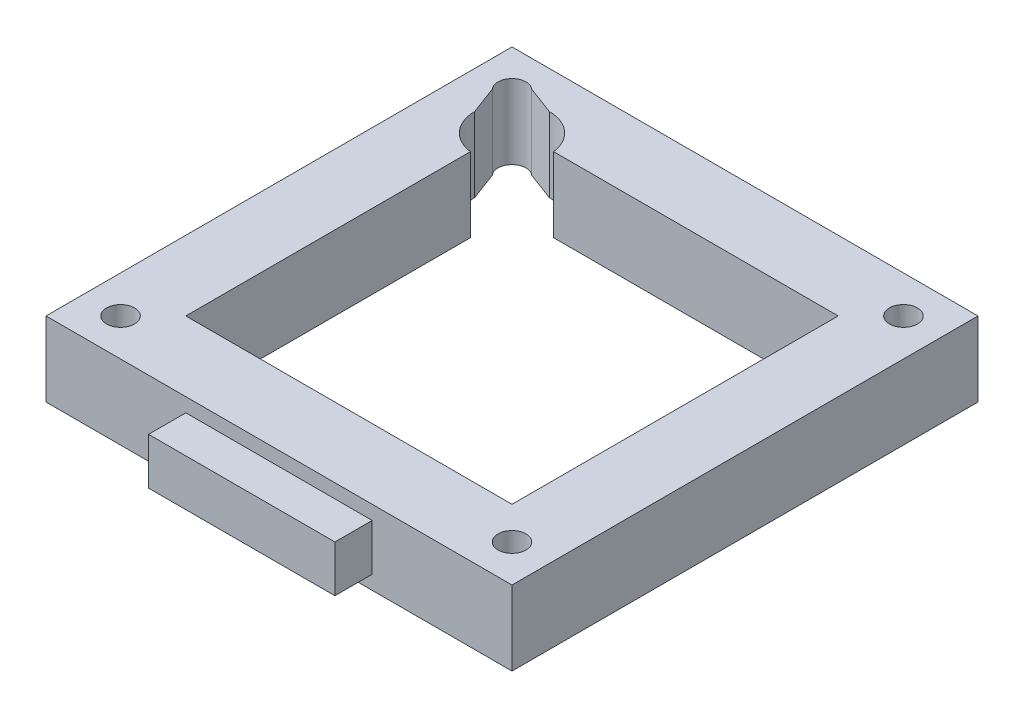
ISO-10303-21;
HEADER;
FILE_DESCRIPTION(('STEP AP214'),'2;1');
FILE_NAME('part.step','',(''),(''),'','','');
FILE_SCHEMA(('AUTOMOTIVE_DESIGN { 1 0 10303 214 1 1 1 1 }'));
ENDSEC;
DATA;
#1=APPLICATION_CONTEXT('core data for automotive mechanical design processes');
#2=APPLICATION_PROTOCOL_DEFINITION('international standard','automotive_design',2000,#1);
#3=PRODUCT_CONTEXT('',#1,'mechanical');
#4=PRODUCT('Part','Part','',(#3));
#5=PRODUCT_RELATED_PRODUCT_CATEGORY('part','',(#4));
#6=PRODUCT_DEFINITION_FORMATION('','',#4);
#7=PRODUCT_DEFINITION_CONTEXT('part definition',#1,'design');
#8=PRODUCT_DEFINITION('design','',#6,#7);
#9=PRODUCT_DEFINITION_SHAPE('','',#8);
#10=(LENGTH_UNIT() NAMED_UNIT(*) SI_UNIT(.MILLI.,.METRE.));
#11=(NAMED_UNIT(*) PLANE_ANGLE_UNIT() SI_UNIT($,.RADIAN.));
#12=(NAMED_UNIT(*) SI_UNIT($,.STERADIAN.) SOLID_ANGLE_UNIT());
#13=UNCERTAINTY_MEASURE_WITH_UNIT(LENGTH_MEASURE(1.E-05),#10,'distance_accuracy_value','');
#14=(GEOMETRIC_REPRESENTATION_CONTEXT(3) GLOBAL_UNCERTAINTY_ASSIGNED_CONTEXT((#13)) GLOBAL_UNIT_ASSIGNED_CONTEXT((#10,
#11,#12)) REPRESENTATION_CONTEXT('',''));
#15=CARTESIAN_POINT('',(0.,0.,0.));
#16=DIRECTION('',(0.,0.,1.));
#17=DIRECTION('',(1.,0.,0.));
#18=AXIS2_PLACEMENT_3D('',#15,#16,#17);
#19=CARTESIAN_POINT('',(0.,8.,25.));
#20=DIRECTION('',(0.,0.,-1.));
#21=DIRECTION('',(-1.,0.,0.));
#22=AXIS2_PLACEMENT_3D('',#19,#20,#21);
#23=PLANE('',#22);
#24=DIRECTION('',(1.,0.,0.));
#25=VECTOR('',#24,1.);
#26=CARTESIAN_POINT('',(0.,0.,25.));
#27=LINE('',#26,#25);
#28=CARTESIAN_POINT('',(-25.,0.,25.));
#29=VERTEX_POINT('',#28);
#30=CARTESIAN_POINT('',(25.,0.,25.));
#31=VERTEX_POINT('',#30);
#32=EDGE_CURVE('E384',#29,#31,#27,.T.);
#33=ORIENTED_EDGE('',*,*,#32,.T.);
#34=DIRECTION('',(0.,-1.,0.));
#35=VECTOR('',#34,1.);
#36=CARTESIAN_POINT('',(25.,8.,25.));
#37=LINE('',#36,#35);
#38=CARTESIAN_POINT('',(25.,8.,25.));
#39=VERTEX_POINT('',#38);
#40=EDGE_CURVE('E11',#39,#31,#37,.T.);
#41=ORIENTED_EDGE('',*,*,#40,.F.);
#42=DIRECTION('',(1.,0.,0.));
#43=VECTOR('',#42,1.);
#44=CARTESIAN_POINT('',(0.,8.,25.));
#45=LINE('',#44,#43);
#46=CARTESIAN_POINT('',(-25.,8.,25.));
#47=VERTEX_POINT('',#46);
#48=EDGE_CURVE('E324',#47,#39,#45,.T.);
#49=ORIENTED_EDGE('',*,*,#48,.F.);
#50=DIRECTION('',(0.,-1.,0.));
#51=VECTOR('',#50,1.);
#52=CARTESIAN_POINT('',(-25.,8.,25.));
#53=LINE('',#52,#51);
#54=EDGE_CURVE('E407',#47,#29,#53,.T.);
#55=ORIENTED_EDGE('',*,*,#54,.T.);
#56=EDGE_LOOP('',(#33,#41,#49,#55));
#57=FACE_BOUND('',#56,.T.);
#58=DIRECTION('',(1.,0.,0.));
#59=VECTOR('',#58,1.);
#60=CARTESIAN_POINT('',(0.,1.5000000000053,25.));
#61=LINE('',#60,#59);
#62=CARTESIAN_POINT('',(-10.0000000000553,1.5000000000053,25.));
#63=VERTEX_POINT('',#62);
#64=CARTESIAN_POINT('',(9.9999999999447,1.5000000000053,25.));
#65=VERTEX_POINT('',#64);
#66=EDGE_CURVE('E75',#63,#65,#61,.T.);
#67=ORIENTED_EDGE('',*,*,#66,.F.);
#68=DIRECTION('',(0.,-1.,0.));
#69=VECTOR('',#68,1.);
#70=CARTESIAN_POINT('',(-10.0000000000553,8.,25.));
#71=LINE('',#70,#69);
#72=CARTESIAN_POINT('',(-10.0000000000553,6.5000000000053,25.));
#73=VERTEX_POINT('',#72);
#74=EDGE_CURVE('E250',#73,#63,#71,.T.);
#75=ORIENTED_EDGE('',*,*,#74,.F.);
#76=DIRECTION('',(-1.,0.,0.));
#77=VECTOR('',#76,1.);
#78=CARTESIAN_POINT('',(0.,6.5000000000053,25.));
#79=LINE('',#78,#77);
#80=CARTESIAN_POINT('',(9.9999999999447,6.5000000000053,25.));
#81=VERTEX_POINT('',#80);
#82=EDGE_CURVE('E266',#81,#73,#79,.T.);
#83=ORIENTED_EDGE('',*,*,#82,.F.);
#84=DIRECTION('',(0.,1.,0.));
#85=VECTOR('',#84,1.);
#86=CARTESIAN_POINT('',(9.9999999999447,8.,25.));
#87=LINE('',#86,#85);
#88=EDGE_CURVE('E262',#65,#81,#87,.T.);
#89=ORIENTED_EDGE('',*,*,#88,.F.);
#90=EDGE_LOOP('',(#67,#75,#83,#89));
#91=FACE_BOUND('',#90,.T.);
#92=ADVANCED_FACE('F49',(#57,#91),#23,.F.);
#93=CARTESIAN_POINT('',(25.,8.,0.));
#94=DIRECTION('',(-1.,0.,0.));
#95=DIRECTION('',(0.,0.,1.));
#96=AXIS2_PLACEMENT_3D('',#93,#94,#95);
#97=PLANE('',#96);
#98=DIRECTION('',(0.,0.,-1.));
#99=VECTOR('',#98,1.);
#100=CARTESIAN_POINT('',(25.,0.,0.));
#101=LINE('',#100,#99);
#102=CARTESIAN_POINT('',(25.,0.,-25.));
#103=VERTEX_POINT('',#102);
#104=EDGE_CURVE('E388',#31,#103,#101,.T.);
#105=ORIENTED_EDGE('',*,*,#104,.T.);
#106=DIRECTION('',(0.,-1.,0.));
#107=VECTOR('',#106,1.);
#108=CARTESIAN_POINT('',(25.,8.,-25.));
#109=LINE('',#108,#107);
#110=CARTESIAN_POINT('',(25.,8.,-25.));
#111=VERTEX_POINT('',#110);
#112=EDGE_CURVE('E59',#111,#103,#109,.T.);
#113=ORIENTED_EDGE('',*,*,#112,.F.);
#114=DIRECTION('',(0.,0.,-1.));
#115=VECTOR('',#114,1.);
#116=CARTESIAN_POINT('',(25.,8.,0.));
#117=LINE('',#116,#115);
#118=EDGE_CURVE('E328',#39,#111,#117,.T.);
#119=ORIENTED_EDGE('',*,*,#118,.F.);
#120=ORIENTED_EDGE('',*,*,#40,.T.);
#121=EDGE_LOOP('',(#105,#113,#119,#120));
#122=FACE_BOUND('',#121,.T.);
#123=ADVANCED_FACE('F495',(#122),#97,.F.);
#124=CARTESIAN_POINT('',(0.,8.,-25.));
#125=DIRECTION('',(0.,0.,-1.));
#126=DIRECTION('',(-1.,0.,0.));
#127=AXIS2_PLACEMENT_3D('',#124,#125,#126);
#128=PLANE('',#127);
#129=DIRECTION('',(1.,0.,0.));
#130=VECTOR('',#129,1.);
#131=CARTESIAN_POINT('',(0.,0.,-25.));
#132=LINE('',#131,#130);
#133=CARTESIAN_POINT('',(-25.,0.,-25.));
#134=VERTEX_POINT('',#133);
#135=EDGE_CURVE('E392',#134,#103,#132,.T.);
#136=ORIENTED_EDGE('',*,*,#135,.F.);
#137=DIRECTION('',(0.,-1.,0.));
#138=VECTOR('',#137,1.);
#139=CARTESIAN_POINT('',(-25.,8.,-25.));
#140=LINE('',#139,#138);
#141=CARTESIAN_POINT('',(-25.,8.,-25.));
#142=VERTEX_POINT('',#141);
#143=EDGE_CURVE('E410',#142,#134,#140,.T.);
#144=ORIENTED_EDGE('',*,*,#143,.F.);
#145=DIRECTION('',(1.,0.,0.));
#146=VECTOR('',#145,1.);
#147=CARTESIAN_POINT('',(0.,8.,-25.));
#148=LINE('',#147,#146);
#149=EDGE_CURVE('E331',#142,#111,#148,.T.);
#150=ORIENTED_EDGE('',*,*,#149,.T.);
#151=ORIENTED_EDGE('',*,*,#112,.T.);
#152=EDGE_LOOP('',(#136,#144,#150,#151));
#153=FACE_BOUND('',#152,.T.);
#154=ADVANCED_FACE('F493',(#153),#128,.T.);
#155=CARTESIAN_POINT('',(-17.,8.,-17.));
#156=DIRECTION('',(0.,-1.,0.));
#157=DIRECTION('',(0.,0.,-1.));
#158=AXIS2_PLACEMENT_3D('',#155,#156,#157);
#159=CYLINDRICAL_SURFACE('',#158,4.);
#160=CARTESIAN_POINT('',(-17.,0.,-17.));
#161=DIRECTION('',(0.,1.,0.));
#162=DIRECTION('',(0.,0.,1.));
#163=AXIS2_PLACEMENT_3D('',#160,#161,#162);
#164=CIRCLE('',#163,4.);
#165=CARTESIAN_POINT('',(-13.0313730334031,0.,-17.5));
#166=VERTEX_POINT('',#165);
#167=CARTESIAN_POINT('',(-17.,0.,-21.));
#168=VERTEX_POINT('',#167);
#169=EDGE_CURVE('E287',#166,#168,#164,.T.);
#170=ORIENTED_EDGE('',*,*,#169,.F.);
#171=DIRECTION('',(0.,-1.,0.));
#172=VECTOR('',#171,1.);
#173=CARTESIAN_POINT('',(-13.0313730334031,8.,-17.5));
#174=LINE('',#173,#172);
#175=CARTESIAN_POINT('',(-13.0313730334031,8.,-17.5));
#176=VERTEX_POINT('',#175);
#177=EDGE_CURVE('E53',#176,#166,#174,.T.);
#178=ORIENTED_EDGE('',*,*,#177,.F.);
#179=CARTESIAN_POINT('',(-17.,8.,-17.));
#180=DIRECTION('',(0.,1.,0.));
#181=DIRECTION('',(0.,0.,1.));
#182=AXIS2_PLACEMENT_3D('',#179,#180,#181);
#183=CIRCLE('',#182,4.);
#184=CARTESIAN_POINT('',(-17.,8.,-21.));
#185=VERTEX_POINT('',#184);
#186=EDGE_CURVE('E288',#176,#185,#183,.T.);
#187=ORIENTED_EDGE('',*,*,#186,.T.);
#188=DIRECTION('',(0.,-1.,0.));
#189=VECTOR('',#188,1.);
#190=CARTESIAN_POINT('',(-17.,8.,-21.));
#191=LINE('',#190,#189);
#192=EDGE_CURVE('E347',#185,#168,#191,.T.);
#193=ORIENTED_EDGE('',*,*,#192,.T.);
#194=EDGE_LOOP('',(#170,#178,#187,#193));
#195=FACE_BOUND('',#194,.T.);
#196=ADVANCED_FACE('F445',(#195),#159,.F.);
#197=CARTESIAN_POINT('',(0.,8.,-17.5));
#198=DIRECTION('',(0.,0.,1.));
#199=DIRECTION('',(1.,0.,0.));
#200=AXIS2_PLACEMENT_3D('',#197,#198,#199);
#201=PLANE('',#200);
#202=DIRECTION('',(-1.,0.,0.));
#203=VECTOR('',#202,1.);
#204=CARTESIAN_POINT('',(0.,0.,-17.5));
#205=LINE('',#204,#203);
#206=CARTESIAN_POINT('',(17.5,0.,-17.5));
#207=VERTEX_POINT('',#206);
#208=EDGE_CURVE('E351',#207,#166,#205,.T.);
#209=ORIENTED_EDGE('',*,*,#208,.F.);
#210=DIRECTION('',(0.,-1.,0.));
#211=VECTOR('',#210,1.);
#212=CARTESIAN_POINT('',(17.5,8.,-17.5));
#213=LINE('',#212,#211);
#214=CARTESIAN_POINT('',(17.5,8.,-17.5));
#215=VERTEX_POINT('',#214);
#216=EDGE_CURVE('E434',#215,#207,#213,.T.);
#217=ORIENTED_EDGE('',*,*,#216,.F.);
#218=DIRECTION('',(-1.,0.,0.));
#219=VECTOR('',#218,1.);
#220=CARTESIAN_POINT('',(0.,8.,-17.5));
#221=LINE('',#220,#219);
#222=EDGE_CURVE('E292',#215,#176,#221,.T.);
#223=ORIENTED_EDGE('',*,*,#222,.T.);
#224=ORIENTED_EDGE('',*,*,#177,.T.);
#225=EDGE_LOOP('',(#209,#217,#223,#224));
#226=FACE_BOUND('',#225,.T.);
#227=ADVANCED_FACE('F51',(#226),#201,.T.);
#228=CARTESIAN_POINT('',(17.5,8.,0.));
#229=DIRECTION('',(-1.,0.,0.));
#230=DIRECTION('',(0.,0.,1.));
#231=AXIS2_PLACEMENT_3D('',#228,#229,#230);
#232=PLANE('',#231);
#233=DIRECTION('',(0.,0.,-1.));
#234=VECTOR('',#233,1.);
#235=CARTESIAN_POINT('',(17.5,0.,0.));
#236=LINE('',#235,#234);
#237=CARTESIAN_POINT('',(17.5,0.,17.5));
#238=VERTEX_POINT('',#237);
#239=EDGE_CURVE('E356',#238,#207,#236,.T.);
#240=ORIENTED_EDGE('',*,*,#239,.F.);
#241=DIRECTION('',(0.,-1.,0.));
#242=VECTOR('',#241,1.);
#243=CARTESIAN_POINT('',(17.5,8.,17.5));
#244=LINE('',#243,#242);
#245=CARTESIAN_POINT('',(17.5,8.,17.5));
#246=VERTEX_POINT('',#245);
#247=EDGE_CURVE('E432',#246,#238,#244,.T.);
#248=ORIENTED_EDGE('',*,*,#247,.F.);
#249=DIRECTION('',(0.,0.,-1.));
#250=VECTOR('',#249,1.);
#251=CARTESIAN_POINT('',(17.5,8.,0.));
#252=LINE('',#251,#250);
#253=EDGE_CURVE('E298',#246,#215,#252,.T.);
#254=ORIENTED_EDGE('',*,*,#253,.T.);
#255=ORIENTED_EDGE('',*,*,#216,.T.);
#256=EDGE_LOOP('',(#240,#248,#254,#255));
#257=FACE_BOUND('',#256,.T.);
#258=ADVANCED_FACE('F453',(#257),#232,.T.);
#259=CARTESIAN_POINT('',(0.,8.,17.5));
#260=DIRECTION('',(0.,0.,-1.));
#261=DIRECTION('',(-1.,0.,0.));
#262=AXIS2_PLACEMENT_3D('',#259,#260,#261);
#263=PLANE('',#262);
#264=DIRECTION('',(1.,0.,0.));
#265=VECTOR('',#264,1.);
#266=CARTESIAN_POINT('',(0.,0.,17.5));
#267=LINE('',#266,#265);
#268=CARTESIAN_POINT('',(-17.5,0.,17.5));
#269=VERTEX_POINT('',#268);
#270=EDGE_CURVE('E360',#269,#238,#267,.T.);
#271=ORIENTED_EDGE('',*,*,#270,.F.);
#272=DIRECTION('',(0.,-1.,0.));
#273=VECTOR('',#272,1.);
#274=CARTESIAN_POINT('',(-17.5,8.,17.5));
#275=LINE('',#274,#273);
#276=CARTESIAN_POINT('',(-17.5,8.,17.5));
#277=VERTEX_POINT('',#276);
#278=EDGE_CURVE('E429',#277,#269,#275,.T.);
#279=ORIENTED_EDGE('',*,*,#278,.F.);
#280=DIRECTION('',(1.,0.,0.));
#281=VECTOR('',#280,1.);
#282=CARTESIAN_POINT('',(0.,8.,17.5));
#283=LINE('',#282,#281);
#284=EDGE_CURVE('E302',#277,#246,#283,.T.);
#285=ORIENTED_EDGE('',*,*,#284,.T.);
#286=ORIENTED_EDGE('',*,*,#247,.T.);
#287=EDGE_LOOP('',(#271,#279,#285,#286));
#288=FACE_BOUND('',#287,.T.);
#289=ADVANCED_FACE('F460',(#288),#263,.T.);
#290=CARTESIAN_POINT('',(-17.5,8.,0.));
#291=DIRECTION('',(-1.,0.,0.));
#292=DIRECTION('',(0.,0.,1.));
#293=AXIS2_PLACEMENT_3D('',#290,#291,#292);
#294=PLANE('',#293);
#295=DIRECTION('',(0.,0.,-1.));
#296=VECTOR('',#295,1.);
#297=CARTESIAN_POINT('',(-17.5,0.,0.));
#298=LINE('',#297,#296);
#299=CARTESIAN_POINT('',(-17.5,0.,-13.0313730334031));
#300=VERTEX_POINT('',#299);
#301=EDGE_CURVE('E364',#269,#300,#298,.T.);
#302=ORIENTED_EDGE('',*,*,#301,.T.);
#303=DIRECTION('',(0.,-1.,0.));
#304=VECTOR('',#303,1.);
#305=CARTESIAN_POINT('',(-17.5,8.,-13.0313730334031));
#306=LINE('',#305,#304);
#307=CARTESIAN_POINT('',(-17.5,8.,-13.0313730334031));
#308=VERTEX_POINT('',#307);
#309=EDGE_CURVE('E426',#308,#300,#306,.T.);
#310=ORIENTED_EDGE('',*,*,#309,.F.);
#311=DIRECTION('',(0.,0.,-1.));
#312=VECTOR('',#311,1.);
#313=CARTESIAN_POINT('',(-17.5,8.,0.));
#314=LINE('',#313,#312);
#315=EDGE_CURVE('E306',#277,#308,#314,.T.);
#316=ORIENTED_EDGE('',*,*,#315,.F.);
#317=ORIENTED_EDGE('',*,*,#278,.T.);
#318=EDGE_LOOP('',(#302,#310,#316,#317));
#319=FACE_BOUND('',#318,.T.);
#320=ADVANCED_FACE('F464',(#319),#294,.F.);
#321=CARTESIAN_POINT('',(-21.,0.,-17.));
#322=VERTEX_POINT('',#321);
#323=EDGE_CURVE('E352',#322,#300,#164,.T.);
#324=ORIENTED_EDGE('',*,*,#323,.F.);
#325=DIRECTION('',(0.,-1.,0.));
#326=VECTOR('',#325,1.);
#327=CARTESIAN_POINT('',(-21.,8.,-17.));
#328=LINE('',#327,#326);
#329=CARTESIAN_POINT('',(-21.,8.,-17.));
#330=VERTEX_POINT('',#329);
#331=EDGE_CURVE('E423',#330,#322,#328,.T.);
#332=ORIENTED_EDGE('',*,*,#331,.F.);
#333=EDGE_CURVE('E294',#330,#308,#183,.T.);
#334=ORIENTED_EDGE('',*,*,#333,.T.);
#335=ORIENTED_EDGE('',*,*,#309,.T.);
#336=EDGE_LOOP('',(#324,#332,#334,#335));
#337=FACE_BOUND('',#336,.T.);
#338=ADVANCED_FACE('F483',(#337),#159,.F.);
#339=CARTESIAN_POINT('',(-12.8219178082192,8.,4.80821917808219));
#340=DIRECTION('',(0.936329177569045,0.,-0.351123441588392));
#341=DIRECTION('',(-0.351123441588392,0.,-0.936329177569045));
#342=AXIS2_PLACEMENT_3D('',#339,#340,#341);
#343=PLANE('',#342);
#344=DIRECTION('',(0.351123441588392,0.,0.936329177569044));
#345=VECTOR('',#344,1.);
#346=CARTESIAN_POINT('',(-12.8219178082192,0.,4.80821917808219));
#347=LINE('',#346,#345);
#348=CARTESIAN_POINT('',(-22.1301369863014,0.,-20.013698630137));
#349=VERTEX_POINT('',#348);
#350=EDGE_CURVE('E368',#349,#322,#347,.T.);
#351=ORIENTED_EDGE('',*,*,#350,.F.);
#352=DIRECTION('',(0.,-1.,0.));
#353=VECTOR('',#352,1.);
#354=CARTESIAN_POINT('',(-22.1301369863014,8.,-20.013698630137));
#355=LINE('',#354,#353);
#356=CARTESIAN_POINT('',(-22.1301369863014,8.,-20.013698630137));
#357=VERTEX_POINT('',#356);
#358=EDGE_CURVE('E420',#357,#349,#355,.T.);
#359=ORIENTED_EDGE('',*,*,#358,.F.);
#360=DIRECTION('',(0.351123441588392,0.,0.936329177569044));
#361=VECTOR('',#360,1.);
#362=CARTESIAN_POINT('',(-12.8219178082192,8.,4.80821917808219));
#363=LINE('',#362,#361);
#364=EDGE_CURVE('E309',#357,#330,#363,.T.);
#365=ORIENTED_EDGE('',*,*,#364,.T.);
#366=ORIENTED_EDGE('',*,*,#331,.T.);
#367=EDGE_LOOP('',(#351,#359,#365,#366));
#368=FACE_BOUND('',#367,.T.);
#369=ADVANCED_FACE('F473',(#368),#343,.T.);
#370=CARTESIAN_POINT('',(-21.,8.,-21.));
#371=DIRECTION('',(0.,-1.,0.));
#372=DIRECTION('',(0.,0.,-1.));
#373=AXIS2_PLACEMENT_3D('',#370,#371,#372);
#374=CYLINDRICAL_SURFACE('',#373,1.5);
#375=CARTESIAN_POINT('',(-21.,0.,-21.));
#376=DIRECTION('',(0.,1.,0.));
#377=DIRECTION('',(0.,0.,1.));
#378=AXIS2_PLACEMENT_3D('',#375,#376,#377);
#379=CIRCLE('',#378,1.5);
#380=CARTESIAN_POINT('',(-20.013698630137,0.,-22.1301369863014));
#381=VERTEX_POINT('',#380);
#382=EDGE_CURVE('E372',#381,#349,#379,.T.);
#383=ORIENTED_EDGE('',*,*,#382,.F.);
#384=DIRECTION('',(0.,-1.,0.));
#385=VECTOR('',#384,1.);
#386=CARTESIAN_POINT('',(-20.013698630137,8.,-22.1301369863014));
#387=LINE('',#386,#385);
#388=CARTESIAN_POINT('',(-20.013698630137,8.,-22.1301369863014));
#389=VERTEX_POINT('',#388);
#390=EDGE_CURVE('E417',#389,#381,#387,.T.);
#391=ORIENTED_EDGE('',*,*,#390,.F.);
#392=CARTESIAN_POINT('',(-21.,8.,-21.));
#393=DIRECTION('',(0.,1.,0.));
#394=DIRECTION('',(0.,0.,1.));
#395=AXIS2_PLACEMENT_3D('',#392,#393,#394);
#396=CIRCLE('',#395,1.5);
#397=EDGE_CURVE('E313',#389,#357,#396,.T.);
#398=ORIENTED_EDGE('',*,*,#397,.T.);
#399=ORIENTED_EDGE('',*,*,#358,.T.);
#400=EDGE_LOOP('',(#383,#391,#398,#399));
#401=FACE_BOUND('',#400,.T.);
#402=ADVANCED_FACE('F477',(#401),#374,.F.);
#403=CARTESIAN_POINT('',(21.,8.,21.));
#404=DIRECTION('',(0.,-1.,0.));
#405=DIRECTION('',(0.,0.,-1.));
#406=AXIS2_PLACEMENT_3D('',#403,#404,#405);
#407=CYLINDRICAL_SURFACE('',#406,1.5);
#408=CARTESIAN_POINT('',(21.,8.,21.));
#409=DIRECTION('',(0.,1.,0.));
#410=DIRECTION('',(0.,0.,1.));
#411=AXIS2_PLACEMENT_3D('',#408,#409,#410);
#412=CIRCLE('',#411,1.5);
#413=CARTESIAN_POINT('',(21.,8.,22.5));
#414=VERTEX_POINT('',#413);
#415=EDGE_CURVE('E339',#414,#414,#412,.T.);
#416=ORIENTED_EDGE('',*,*,#415,.T.);
#417=EDGE_LOOP('',(#416));
#418=FACE_BOUND('',#417,.T.);
#419=CARTESIAN_POINT('',(21.,0.,21.));
#420=DIRECTION('',(0.,1.,0.));
#421=DIRECTION('',(0.,0.,1.));
#422=AXIS2_PLACEMENT_3D('',#419,#420,#421);
#423=CIRCLE('',#422,1.5);
#424=CARTESIAN_POINT('',(21.,0.,22.5));
#425=VERTEX_POINT('',#424);
#426=EDGE_CURVE('E400',#425,#425,#423,.T.);
#427=ORIENTED_EDGE('',*,*,#426,.F.);
#428=EDGE_LOOP('',(#427));
#429=FACE_BOUND('',#428,.T.);
#430=ADVANCED_FACE('F514',(#418,#429),#407,.F.);
#431=CARTESIAN_POINT('',(-25.,8.,0.));
#432=DIRECTION('',(-1.,0.,0.));
#433=DIRECTION('',(0.,0.,1.));
#434=AXIS2_PLACEMENT_3D('',#431,#432,#433);
#435=PLANE('',#434);
#436=DIRECTION('',(0.,0.,-1.));
#437=VECTOR('',#436,1.);
#438=CARTESIAN_POINT('',(-25.,6.5,0.));
#439=LINE('',#438,#437);
#440=CARTESIAN_POINT('',(-25.,6.5,10.));
#441=VERTEX_POINT('',#440);
#442=CARTESIAN_POINT('',(-25.,6.5,-10.));
#443=VERTEX_POINT('',#442);
#444=EDGE_CURVE('E67',#441,#443,#439,.T.);
#445=ORIENTED_EDGE('',*,*,#444,.F.);
#446=DIRECTION('',(0.,1.,0.));
#447=VECTOR('',#446,1.);
#448=CARTESIAN_POINT('',(-25.,8.,10.));
#449=LINE('',#448,#447);
#450=CARTESIAN_POINT('',(-25.,1.5,10.));
#451=VERTEX_POINT('',#450);
#452=EDGE_CURVE('E218',#451,#441,#449,.T.);
#453=ORIENTED_EDGE('',*,*,#452,.F.);
#454=DIRECTION('',(0.,0.,1.));
#455=VECTOR('',#454,1.);
#456=CARTESIAN_POINT('',(-25.,1.50000000000004,0.));
#457=LINE('',#456,#455);
#458=CARTESIAN_POINT('',(-25.,1.50000000000007,-10.));
#459=VERTEX_POINT('',#458);
#460=EDGE_CURVE('E222',#459,#451,#457,.T.);
#461=ORIENTED_EDGE('',*,*,#460,.F.);
#462=DIRECTION('',(0.,-1.,0.));
#463=VECTOR('',#462,1.);
#464=CARTESIAN_POINT('',(-25.,8.,-10.));
#465=LINE('',#464,#463);
#466=EDGE_CURVE('E231',#443,#459,#465,.T.);
#467=ORIENTED_EDGE('',*,*,#466,.F.);
#468=EDGE_LOOP('',(#445,#453,#461,#467));
#469=FACE_BOUND('',#468,.T.);
#470=DIRECTION('',(0.,0.,-1.));
#471=VECTOR('',#470,1.);
#472=CARTESIAN_POINT('',(-25.,0.,0.));
#473=LINE('',#472,#471);
#474=EDGE_CURVE('E396',#29,#134,#473,.T.);
#475=ORIENTED_EDGE('',*,*,#474,.F.);
#476=ORIENTED_EDGE('',*,*,#54,.F.);
#477=DIRECTION('',(0.,0.,-1.));
#478=VECTOR('',#477,1.);
#479=CARTESIAN_POINT('',(-25.,8.,0.));
#480=LINE('',#479,#478);
#481=EDGE_CURVE('E335',#47,#142,#480,.T.);
#482=ORIENTED_EDGE('',*,*,#481,.T.);
#483=ORIENTED_EDGE('',*,*,#143,.T.);
#484=EDGE_LOOP('',(#475,#476,#482,#483));
#485=FACE_BOUND('',#484,.T.);
#486=ADVANCED_FACE('F508',(#469,#485),#435,.T.);
#487=CARTESIAN_POINT('',(21.,8.,-21.));
#488=DIRECTION('',(0.,-1.,0.));
#489=DIRECTION('',(0.,0.,-1.));
#490=AXIS2_PLACEMENT_3D('',#487,#488,#489);
#491=CYLINDRICAL_SURFACE('',#490,1.5);
#492=CARTESIAN_POINT('',(21.,8.,-21.));
#493=DIRECTION('',(0.,1.,0.));
#494=DIRECTION('',(0.,0.,1.));
#495=AXIS2_PLACEMENT_3D('',#492,#493,#494);
#496=CIRCLE('',#495,1.5);
#497=CARTESIAN_POINT('',(21.,8.,-19.5));
#498=VERTEX_POINT('',#497);
#499=EDGE_CURVE('E320',#498,#498,#496,.F.);
#500=ORIENTED_EDGE('',*,*,#499,.F.);
#501=EDGE_LOOP('',(#500));
#502=FACE_BOUND('',#501,.T.);
#503=CARTESIAN_POINT('',(21.,0.,-21.));
#504=DIRECTION('',(0.,1.,0.));
#505=DIRECTION('',(0.,0.,1.));
#506=AXIS2_PLACEMENT_3D('',#503,#504,#505);
#507=CIRCLE('',#506,1.5);
#508=CARTESIAN_POINT('',(21.,0.,-19.5));
#509=VERTEX_POINT('',#508);
#510=EDGE_CURVE('E380',#509,#509,#507,.F.);
#511=ORIENTED_EDGE('',*,*,#510,.T.);
#512=EDGE_LOOP('',(#511));
#513=FACE_BOUND('',#512,.T.);
#514=ADVANCED_FACE('F505',(#502,#513),#491,.F.);
#515=CARTESIAN_POINT('',(4.80821917808219,8.,-12.8219178082192));
#516=DIRECTION('',(0.351123441588392,0.,-0.936329177569045));
#517=DIRECTION('',(-0.936329177569045,0.,-0.351123441588392));
#518=AXIS2_PLACEMENT_3D('',#515,#516,#517);
#519=PLANE('',#518);
#520=DIRECTION('',(0.936329177569044,0.,0.351123441588392));
#521=VECTOR('',#520,1.);
#522=CARTESIAN_POINT('',(4.80821917808219,0.,-12.8219178082192));
#523=LINE('',#522,#521);
#524=EDGE_CURVE('E376',#381,#168,#523,.T.);
#525=ORIENTED_EDGE('',*,*,#524,.T.);
#526=ORIENTED_EDGE('',*,*,#192,.F.);
#527=DIRECTION('',(0.936329177569044,0.,0.351123441588392));
#528=VECTOR('',#527,1.);
#529=CARTESIAN_POINT('',(4.80821917808219,8.,-12.8219178082192));
#530=LINE('',#529,#528);
#531=EDGE_CURVE('E317',#389,#185,#530,.T.);
#532=ORIENTED_EDGE('',*,*,#531,.F.);
#533=ORIENTED_EDGE('',*,*,#390,.T.);
#534=EDGE_LOOP('',(#525,#526,#532,#533));
#535=FACE_BOUND('',#534,.T.);
#536=ADVANCED_FACE('F480',(#535),#519,.F.);
#537=CARTESIAN_POINT('',(-21.,8.,21.));
#538=DIRECTION('',(0.,-1.,0.));
#539=DIRECTION('',(0.,0.,-1.));
#540=AXIS2_PLACEMENT_3D('',#537,#538,#539);
#541=CYLINDRICAL_SURFACE('',#540,1.5);
#542=CARTESIAN_POINT('',(-21.,8.,21.));
#543=DIRECTION('',(0.,1.,0.));
#544=DIRECTION('',(0.,0.,1.));
#545=AXIS2_PLACEMENT_3D('',#542,#543,#544);
#546=CIRCLE('',#545,1.5);
#547=CARTESIAN_POINT('',(-21.,8.,22.5));
#548=VERTEX_POINT('',#547);
#549=EDGE_CURVE('E343',#548,#548,#546,.F.);
#550=ORIENTED_EDGE('',*,*,#549,.F.);
#551=EDGE_LOOP('',(#550));
#552=FACE_BOUND('',#551,.T.);
#553=CARTESIAN_POINT('',(-21.,0.,21.));
#554=DIRECTION('',(0.,1.,0.));
#555=DIRECTION('',(0.,0.,1.));
#556=AXIS2_PLACEMENT_3D('',#553,#554,#555);
#557=CIRCLE('',#556,1.5);
#558=CARTESIAN_POINT('',(-21.,0.,22.5));
#559=VERTEX_POINT('',#558);
#560=EDGE_CURVE('E293',#559,#559,#557,.F.);
#561=ORIENTED_EDGE('',*,*,#560,.T.);
#562=EDGE_LOOP('',(#561));
#563=FACE_BOUND('',#562,.T.);
#564=ADVANCED_FACE('F512',(#552,#563),#541,.F.);
#565=CARTESIAN_POINT('',(0.,8.,0.));
#566=DIRECTION('',(0.,1.,0.));
#567=DIRECTION('',(0.,0.,1.));
#568=AXIS2_PLACEMENT_3D('',#565,#566,#567);
#569=PLANE('',#568);
#570=ORIENTED_EDGE('',*,*,#186,.F.);
#571=ORIENTED_EDGE('',*,*,#222,.F.);
#572=ORIENTED_EDGE('',*,*,#253,.F.);
#573=ORIENTED_EDGE('',*,*,#284,.F.);
#574=ORIENTED_EDGE('',*,*,#315,.T.);
#575=ORIENTED_EDGE('',*,*,#333,.F.);
#576=ORIENTED_EDGE('',*,*,#364,.F.);
#577=ORIENTED_EDGE('',*,*,#397,.F.);
#578=ORIENTED_EDGE('',*,*,#531,.T.);
#579=EDGE_LOOP('',(#570,#571,#572,#573,#574,#575,#576,#577,#578));
#580=FACE_BOUND('',#579,.T.);
#581=ORIENTED_EDGE('',*,*,#499,.T.);
#582=EDGE_LOOP('',(#581));
#583=FACE_BOUND('',#582,.T.);
#584=ORIENTED_EDGE('',*,*,#48,.T.);
#585=ORIENTED_EDGE('',*,*,#118,.T.);
#586=ORIENTED_EDGE('',*,*,#149,.F.);
#587=ORIENTED_EDGE('',*,*,#481,.F.);
#588=EDGE_LOOP('',(#584,#585,#586,#587));
#589=FACE_BOUND('',#588,.T.);
#590=ORIENTED_EDGE('',*,*,#415,.F.);
#591=EDGE_LOOP('',(#590));
#592=FACE_BOUND('',#591,.T.);
#593=ORIENTED_EDGE('',*,*,#549,.T.);
#594=EDGE_LOOP('',(#593));
#595=FACE_BOUND('',#594,.T.);
#596=ADVANCED_FACE('F458',(#580,#583,#589,#592,#595),#569,.T.);
#597=CARTESIAN_POINT('',(0.,0.,0.));
#598=DIRECTION('',(0.,1.,0.));
#599=DIRECTION('',(0.,0.,1.));
#600=AXIS2_PLACEMENT_3D('',#597,#598,#599);
#601=PLANE('',#600);
#602=ORIENTED_EDGE('',*,*,#169,.T.);
#603=ORIENTED_EDGE('',*,*,#524,.F.);
#604=ORIENTED_EDGE('',*,*,#382,.T.);
#605=ORIENTED_EDGE('',*,*,#350,.T.);
#606=ORIENTED_EDGE('',*,*,#323,.T.);
#607=ORIENTED_EDGE('',*,*,#301,.F.);
#608=ORIENTED_EDGE('',*,*,#270,.T.);
#609=ORIENTED_EDGE('',*,*,#239,.T.);
#610=ORIENTED_EDGE('',*,*,#208,.T.);
#611=EDGE_LOOP('',(#602,#603,#604,#605,#606,#607,#608,#609,#610));
#612=FACE_BOUND('',#611,.T.);
#613=ORIENTED_EDGE('',*,*,#510,.F.);
#614=EDGE_LOOP('',(#613));
#615=FACE_BOUND('',#614,.T.);
#616=ORIENTED_EDGE('',*,*,#32,.F.);
#617=ORIENTED_EDGE('',*,*,#474,.T.);
#618=ORIENTED_EDGE('',*,*,#135,.T.);
#619=ORIENTED_EDGE('',*,*,#104,.F.);
#620=EDGE_LOOP('',(#616,#617,#618,#619));
#621=FACE_BOUND('',#620,.T.);
#622=ORIENTED_EDGE('',*,*,#426,.T.);
#623=EDGE_LOOP('',(#622));
#624=FACE_BOUND('',#623,.T.);
#625=ORIENTED_EDGE('',*,*,#560,.F.);
#626=EDGE_LOOP('',(#625));
#627=FACE_BOUND('',#626,.T.);
#628=ADVANCED_FACE('F449',(#612,#615,#621,#624,#627),#601,.F.);
#629=CARTESIAN_POINT('',(0.,1.5000000000053,29.));
#630=DIRECTION('',(0.,1.,0.));
#631=DIRECTION('',(0.,0.,1.));
#632=AXIS2_PLACEMENT_3D('',#629,#630,#631);
#633=PLANE('',#632);
#634=ORIENTED_EDGE('',*,*,#66,.T.);
#635=DIRECTION('',(0.,0.,-1.));
#636=VECTOR('',#635,1.);
#637=CARTESIAN_POINT('',(9.9999999999447,1.5000000000053,29.));
#638=LINE('',#637,#636);
#639=CARTESIAN_POINT('',(9.9999999999447,1.5000000000053,29.));
#640=VERTEX_POINT('',#639);
#641=EDGE_CURVE('E283',#640,#65,#638,.T.);
#642=ORIENTED_EDGE('',*,*,#641,.F.);
#643=DIRECTION('',(1.,0.,0.));
#644=VECTOR('',#643,1.);
#645=CARTESIAN_POINT('',(0.,1.5000000000053,29.));
#646=LINE('',#645,#644);
#647=CARTESIAN_POINT('',(-10.0000000000553,1.5000000000053,29.));
#648=VERTEX_POINT('',#647);
#649=EDGE_CURVE('E245',#648,#640,#646,.T.);
#650=ORIENTED_EDGE('',*,*,#649,.F.);
#651=DIRECTION('',(0.,0.,-1.));
#652=VECTOR('',#651,1.);
#653=CARTESIAN_POINT('',(-10.0000000000553,1.5000000000053,29.));
#654=LINE('',#653,#652);
#655=EDGE_CURVE('E259',#648,#63,#654,.T.);
#656=ORIENTED_EDGE('',*,*,#655,.T.);
#657=EDGE_LOOP('',(#634,#642,#650,#656));
#658=FACE_BOUND('',#657,.T.);
#659=ADVANCED_FACE('F556',(#658),#633,.F.);
#660=CARTESIAN_POINT('',(9.9999999999447,8.,29.));
#661=DIRECTION('',(-1.,0.,0.));
#662=DIRECTION('',(0.,0.,1.));
#663=AXIS2_PLACEMENT_3D('',#660,#661,#662);
#664=PLANE('',#663);
#665=ORIENTED_EDGE('',*,*,#88,.T.);
#666=DIRECTION('',(0.,0.,-1.));
#667=VECTOR('',#666,1.);
#668=CARTESIAN_POINT('',(9.9999999999447,6.5000000000053,29.));
#669=LINE('',#668,#667);
#670=CARTESIAN_POINT('',(9.9999999999447,6.5000000000053,29.));
#671=VERTEX_POINT('',#670);
#672=EDGE_CURVE('E279',#671,#81,#669,.T.);
#673=ORIENTED_EDGE('',*,*,#672,.F.);
#674=DIRECTION('',(0.,1.,0.));
#675=VECTOR('',#674,1.);
#676=CARTESIAN_POINT('',(9.9999999999447,8.,29.));
#677=LINE('',#676,#675);
#678=EDGE_CURVE('E249',#640,#671,#677,.T.);
#679=ORIENTED_EDGE('',*,*,#678,.F.);
#680=ORIENTED_EDGE('',*,*,#641,.T.);
#681=EDGE_LOOP('',(#665,#673,#679,#680));
#682=FACE_BOUND('',#681,.T.);
#683=ADVANCED_FACE('F560',(#682),#664,.F.);
#684=CARTESIAN_POINT('',(0.,6.5000000000053,29.));
#685=DIRECTION('',(0.,-1.,0.));
#686=DIRECTION('',(0.,0.,-1.));
#687=AXIS2_PLACEMENT_3D('',#684,#685,#686);
#688=PLANE('',#687);
#689=ORIENTED_EDGE('',*,*,#82,.T.);
#690=DIRECTION('',(0.,0.,-1.));
#691=VECTOR('',#690,1.);
#692=CARTESIAN_POINT('',(-10.0000000000553,6.5000000000053,29.));
#693=LINE('',#692,#691);
#694=CARTESIAN_POINT('',(-10.0000000000553,6.5000000000053,29.));
#695=VERTEX_POINT('',#694);
#696=EDGE_CURVE('E275',#695,#73,#693,.T.);
#697=ORIENTED_EDGE('',*,*,#696,.F.);
#698=DIRECTION('',(-1.,0.,0.));
#699=VECTOR('',#698,1.);
#700=CARTESIAN_POINT('',(0.,6.5000000000053,29.));
#701=LINE('',#700,#699);
#702=EDGE_CURVE('E253',#671,#695,#701,.T.);
#703=ORIENTED_EDGE('',*,*,#702,.F.);
#704=ORIENTED_EDGE('',*,*,#672,.T.);
#705=EDGE_LOOP('',(#689,#697,#703,#704));
#706=FACE_BOUND('',#705,.T.);
#707=ADVANCED_FACE('F566',(#706),#688,.F.);
#708=CARTESIAN_POINT('',(-10.0000000000553,8.,29.));
#709=DIRECTION('',(1.,0.,0.));
#710=DIRECTION('',(0.,0.,-1.));
#711=AXIS2_PLACEMENT_3D('',#708,#709,#710);
#712=PLANE('',#711);
#713=ORIENTED_EDGE('',*,*,#74,.T.);
#714=ORIENTED_EDGE('',*,*,#655,.F.);
#715=DIRECTION('',(0.,-1.,0.));
#716=VECTOR('',#715,1.);
#717=CARTESIAN_POINT('',(-10.0000000000553,8.,29.));
#718=LINE('',#717,#716);
#719=EDGE_CURVE('E256',#695,#648,#718,.T.);
#720=ORIENTED_EDGE('',*,*,#719,.F.);
#721=ORIENTED_EDGE('',*,*,#696,.T.);
#722=EDGE_LOOP('',(#713,#714,#720,#721));
#723=FACE_BOUND('',#722,.T.);
#724=ADVANCED_FACE('F570',(#723),#712,.F.);
#725=CARTESIAN_POINT('',(0.,0.,29.));
#726=DIRECTION('',(0.,0.,1.));
#727=DIRECTION('',(1.,0.,0.));
#728=AXIS2_PLACEMENT_3D('',#725,#726,#727);
#729=PLANE('',#728);
#730=ORIENTED_EDGE('',*,*,#649,.T.);
#731=ORIENTED_EDGE('',*,*,#678,.T.);
#732=ORIENTED_EDGE('',*,*,#702,.T.);
#733=ORIENTED_EDGE('',*,*,#719,.T.);
#734=EDGE_LOOP('',(#730,#731,#732,#733));
#735=FACE_BOUND('',#734,.T.);
#736=ADVANCED_FACE('F574',(#735),#729,.T.);
#737=CARTESIAN_POINT('',(-21.,6.5,0.));
#738=DIRECTION('',(0.,1.,0.));
#739=DIRECTION('',(0.,0.,1.));
#740=AXIS2_PLACEMENT_3D('',#737,#738,#739);
#741=PLANE('',#740);
#742=ORIENTED_EDGE('',*,*,#444,.T.);
#743=DIRECTION('',(-1.,0.,0.));
#744=VECTOR('',#743,1.);
#745=CARTESIAN_POINT('',(-21.,6.5,-10.));
#746=LINE('',#745,#744);
#747=CARTESIAN_POINT('',(-21.,6.5,-10.));
#748=VERTEX_POINT('',#747);
#749=EDGE_CURVE('E193',#748,#443,#746,.T.);
#750=ORIENTED_EDGE('',*,*,#749,.F.);
#751=DIRECTION('',(0.,0.,-1.));
#752=VECTOR('',#751,1.);
#753=CARTESIAN_POINT('',(-21.,6.5,0.));
#754=LINE('',#753,#752);
#755=CARTESIAN_POINT('',(-21.,6.5,10.));
#756=VERTEX_POINT('',#755);
#757=EDGE_CURVE('E197',#756,#748,#754,.T.);
#758=ORIENTED_EDGE('',*,*,#757,.F.);
#759=DIRECTION('',(-1.,0.,0.));
#760=VECTOR('',#759,1.);
#761=CARTESIAN_POINT('',(-21.,6.5,10.));
#762=LINE('',#761,#760);
#763=EDGE_CURVE('E237',#756,#441,#762,.T.);
#764=ORIENTED_EDGE('',*,*,#763,.T.);
#765=EDGE_LOOP('',(#742,#750,#758,#764));
#766=FACE_BOUND('',#765,.T.);
#767=ADVANCED_FACE('F195',(#766),#741,.F.);
#768=CARTESIAN_POINT('',(-21.,8.,10.));
#769=DIRECTION('',(0.,0.,1.));
#770=DIRECTION('',(1.,0.,0.));
#771=AXIS2_PLACEMENT_3D('',#768,#769,#770);
#772=PLANE('',#771);
#773=ORIENTED_EDGE('',*,*,#452,.T.);
#774=ORIENTED_EDGE('',*,*,#763,.F.);
#775=DIRECTION('',(0.,1.,0.));
#776=VECTOR('',#775,1.);
#777=CARTESIAN_POINT('',(-21.,8.,10.));
#778=LINE('',#777,#776);
#779=CARTESIAN_POINT('',(-21.,1.5,10.));
#780=VERTEX_POINT('',#779);
#781=EDGE_CURVE('E204',#780,#756,#778,.T.);
#782=ORIENTED_EDGE('',*,*,#781,.F.);
#783=DIRECTION('',(-1.,0.,0.));
#784=VECTOR('',#783,1.);
#785=CARTESIAN_POINT('',(-21.,1.5,10.));
#786=LINE('',#785,#784);
#787=EDGE_CURVE('E240',#780,#451,#786,.T.);
#788=ORIENTED_EDGE('',*,*,#787,.T.);
#789=EDGE_LOOP('',(#773,#774,#782,#788));
#790=FACE_BOUND('',#789,.T.);
#791=ADVANCED_FACE('F581',(#790),#772,.F.);
#792=CARTESIAN_POINT('',(-21.,1.50000000000004,0.));
#793=DIRECTION('',(0.,-1.,0.));
#794=DIRECTION('',(0.,0.,-1.));
#795=AXIS2_PLACEMENT_3D('',#792,#793,#794);
#796=PLANE('',#795);
#797=ORIENTED_EDGE('',*,*,#460,.T.);
#798=ORIENTED_EDGE('',*,*,#787,.F.);
#799=DIRECTION('',(0.,0.,1.));
#800=VECTOR('',#799,1.);
#801=CARTESIAN_POINT('',(-21.,1.50000000000004,0.));
#802=LINE('',#801,#800);
#803=CARTESIAN_POINT('',(-21.,1.50000000000007,-10.));
#804=VERTEX_POINT('',#803);
#805=EDGE_CURVE('E213',#804,#780,#802,.T.);
#806=ORIENTED_EDGE('',*,*,#805,.F.);
#807=DIRECTION('',(-1.,0.,0.));
#808=VECTOR('',#807,1.);
#809=CARTESIAN_POINT('',(-21.,1.50000000000007,-10.));
#810=LINE('',#809,#808);
#811=EDGE_CURVE('E203',#804,#459,#810,.T.);
#812=ORIENTED_EDGE('',*,*,#811,.T.);
#813=EDGE_LOOP('',(#797,#798,#806,#812));
#814=FACE_BOUND('',#813,.T.);
#815=ADVANCED_FACE('F584',(#814),#796,.F.);
#816=CARTESIAN_POINT('',(-21.,8.,-10.));
#817=DIRECTION('',(0.,0.,-1.));
#818=DIRECTION('',(-1.,0.,0.));
#819=AXIS2_PLACEMENT_3D('',#816,#817,#818);
#820=PLANE('',#819);
#821=ORIENTED_EDGE('',*,*,#466,.T.);
#822=ORIENTED_EDGE('',*,*,#811,.F.);
#823=DIRECTION('',(0.,-1.,0.));
#824=VECTOR('',#823,1.);
#825=CARTESIAN_POINT('',(-21.,8.,-10.));
#826=LINE('',#825,#824);
#827=EDGE_CURVE('E207',#748,#804,#826,.T.);
#828=ORIENTED_EDGE('',*,*,#827,.F.);
#829=ORIENTED_EDGE('',*,*,#749,.T.);
#830=EDGE_LOOP('',(#821,#822,#828,#829));
#831=FACE_BOUND('',#830,.T.);
#832=ADVANCED_FACE('F208',(#831),#820,.F.);
#833=CARTESIAN_POINT('',(-21.,0.,0.));
#834=DIRECTION('',(-1.,0.,0.));
#835=DIRECTION('',(0.,0.,1.));
#836=AXIS2_PLACEMENT_3D('',#833,#834,#835);
#837=PLANE('',#836);
#838=ORIENTED_EDGE('',*,*,#757,.T.);
#839=ORIENTED_EDGE('',*,*,#827,.T.);
#840=ORIENTED_EDGE('',*,*,#805,.T.);
#841=ORIENTED_EDGE('',*,*,#781,.T.);
#842=EDGE_LOOP('',(#838,#839,#840,#841));
#843=FACE_BOUND('',#842,.T.);
#844=ADVANCED_FACE('F215',(#843),#837,.T.);
#845=CLOSED_SHELL('',(#92,#123,#154,#196,#227,#258,#289,#320,#338,#369,#402,#430,#486,#514,#536,
#564,#596,#628,#659,#683,#707,#724,#736,#767,#791,#815,#832,#844));
#846=MANIFOLD_SOLID_BREP('B2',#845);
#847=ADVANCED_BREP_SHAPE_REPRESENTATION('',(#18,#846),#14);
#848=SHAPE_DEFINITION_REPRESENTATION(#9,#847);
ENDSEC;
END-ISO-10303-21;
